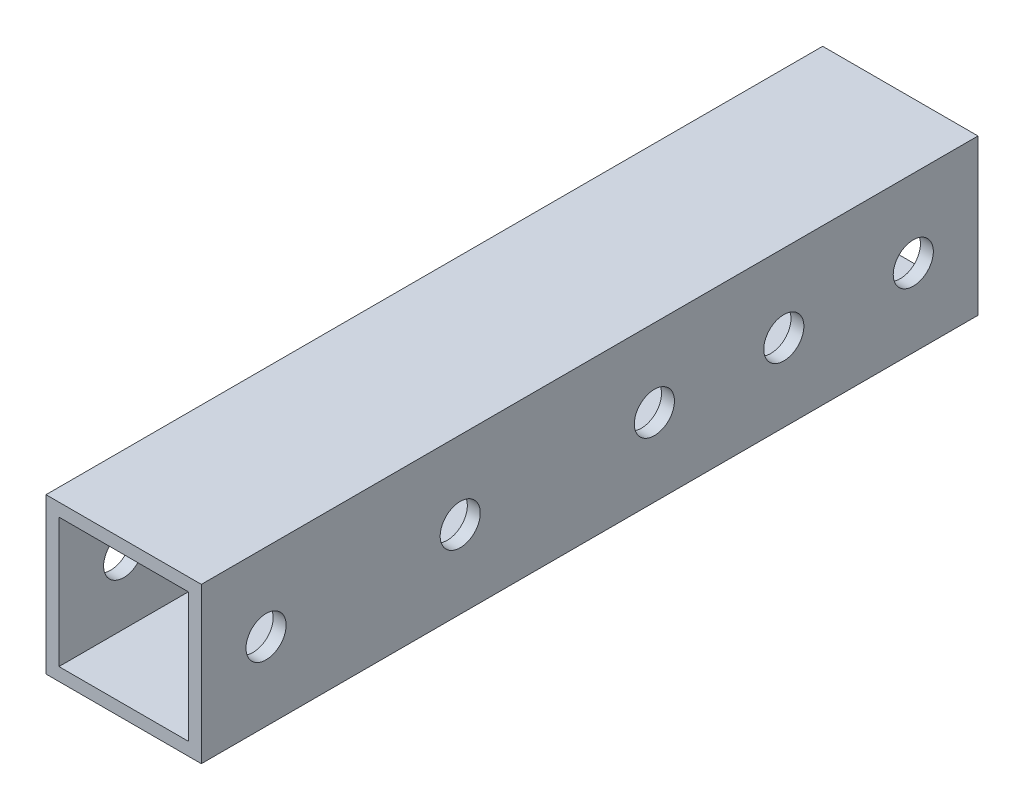
ISO-10303-21;
HEADER;
FILE_DESCRIPTION(('STEP AP214'),'2;1');
FILE_NAME('part.step','',(''),(''),'','','');
FILE_SCHEMA(('AUTOMOTIVE_DESIGN { 1 0 10303 214 1 1 1 1 }'));
ENDSEC;
DATA;
#1=APPLICATION_CONTEXT('core data for automotive mechanical design processes');
#2=APPLICATION_PROTOCOL_DEFINITION('international standard','automotive_design',2000,#1);
#3=PRODUCT_CONTEXT('',#1,'mechanical');
#4=PRODUCT('Part','Part','',(#3));
#5=PRODUCT_RELATED_PRODUCT_CATEGORY('part','',(#4));
#6=PRODUCT_DEFINITION_FORMATION('','',#4);
#7=PRODUCT_DEFINITION_CONTEXT('part definition',#1,'design');
#8=PRODUCT_DEFINITION('design','',#6,#7);
#9=PRODUCT_DEFINITION_SHAPE('','',#8);
#10=(LENGTH_UNIT() NAMED_UNIT(*) SI_UNIT(.MILLI.,.METRE.));
#11=(NAMED_UNIT(*) PLANE_ANGLE_UNIT() SI_UNIT($,.RADIAN.));
#12=(NAMED_UNIT(*) SI_UNIT($,.STERADIAN.) SOLID_ANGLE_UNIT());
#13=UNCERTAINTY_MEASURE_WITH_UNIT(LENGTH_MEASURE(1.E-05),#10,'distance_accuracy_value','');
#14=(GEOMETRIC_REPRESENTATION_CONTEXT(3) GLOBAL_UNCERTAINTY_ASSIGNED_CONTEXT((#13)) GLOBAL_UNIT_ASSIGNED_CONTEXT((#10,
#11,#12)) REPRESENTATION_CONTEXT('',''));
#15=CARTESIAN_POINT('',(0.,0.,0.));
#16=DIRECTION('',(0.,0.,1.));
#17=DIRECTION('',(1.,0.,0.));
#18=AXIS2_PLACEMENT_3D('',#15,#16,#17);
#19=CARTESIAN_POINT('',(0.,0.,-60.));
#20=DIRECTION('',(0.,0.,1.));
#21=DIRECTION('',(-1.,0.,0.));
#22=AXIS2_PLACEMENT_3D('',#19,#20,#21);
#23=PLANE('',#22);
#24=DIRECTION('',(0.,-1.,0.));
#25=VECTOR('',#24,1.);
#26=CARTESIAN_POINT('',(0.,0.,-60.));
#27=LINE('',#26,#25);
#28=CARTESIAN_POINT('',(0.,12.,-60.));
#29=VERTEX_POINT('',#28);
#30=CARTESIAN_POINT('',(0.,0.,-60.));
#31=VERTEX_POINT('',#30);
#32=EDGE_CURVE('E166',#29,#31,#27,.T.);
#33=ORIENTED_EDGE('',*,*,#32,.F.);
#34=DIRECTION('',(-1.,0.,0.));
#35=VECTOR('',#34,1.);
#36=CARTESIAN_POINT('',(0.,12.,-60.));
#37=LINE('',#36,#35);
#38=CARTESIAN_POINT('',(12.,12.,-60.));
#39=VERTEX_POINT('',#38);
#40=EDGE_CURVE('E179',#39,#29,#37,.T.);
#41=ORIENTED_EDGE('',*,*,#40,.F.);
#42=DIRECTION('',(0.,1.,0.));
#43=VECTOR('',#42,1.);
#44=CARTESIAN_POINT('',(12.,0.,-60.));
#45=LINE('',#44,#43);
#46=CARTESIAN_POINT('',(12.,0.,-60.));
#47=VERTEX_POINT('',#46);
#48=EDGE_CURVE('E175',#47,#39,#45,.T.);
#49=ORIENTED_EDGE('',*,*,#48,.F.);
#50=DIRECTION('',(1.,0.,0.));
#51=VECTOR('',#50,1.);
#52=CARTESIAN_POINT('',(0.,0.,-60.));
#53=LINE('',#52,#51);
#54=EDGE_CURVE('E170',#31,#47,#53,.T.);
#55=ORIENTED_EDGE('',*,*,#54,.F.);
#56=EDGE_LOOP('',(#33,#41,#49,#55));
#57=FACE_BOUND('',#56,.T.);
#58=DIRECTION('',(1.,0.,0.));
#59=VECTOR('',#58,1.);
#60=CARTESIAN_POINT('',(1.,1.,-60.));
#61=LINE('',#60,#59);
#62=CARTESIAN_POINT('',(1.,1.,-60.));
#63=VERTEX_POINT('',#62);
#64=CARTESIAN_POINT('',(11.,1.,-60.));
#65=VERTEX_POINT('',#64);
#66=EDGE_CURVE('E117',#63,#65,#61,.T.);
#67=ORIENTED_EDGE('',*,*,#66,.T.);
#68=DIRECTION('',(0.,1.,0.));
#69=VECTOR('',#68,1.);
#70=CARTESIAN_POINT('',(11.,1.,-60.));
#71=LINE('',#70,#69);
#72=CARTESIAN_POINT('',(11.,11.,-60.));
#73=VERTEX_POINT('',#72);
#74=EDGE_CURVE('E127',#65,#73,#71,.T.);
#75=ORIENTED_EDGE('',*,*,#74,.T.);
#76=DIRECTION('',(-1.,0.,0.));
#77=VECTOR('',#76,1.);
#78=CARTESIAN_POINT('',(1.,11.,-60.));
#79=LINE('',#78,#77);
#80=CARTESIAN_POINT('',(1.,11.,-60.));
#81=VERTEX_POINT('',#80);
#82=EDGE_CURVE('E132',#73,#81,#79,.T.);
#83=ORIENTED_EDGE('',*,*,#82,.T.);
#84=DIRECTION('',(0.,-1.,0.));
#85=VECTOR('',#84,1.);
#86=CARTESIAN_POINT('',(1.,1.,-60.));
#87=LINE('',#86,#85);
#88=EDGE_CURVE('E135',#81,#63,#87,.T.);
#89=ORIENTED_EDGE('',*,*,#88,.T.);
#90=EDGE_LOOP('',(#67,#75,#83,#89));
#91=FACE_BOUND('',#90,.T.);
#92=ADVANCED_FACE('F47',(#57,#91),#23,.F.);
#93=CARTESIAN_POINT('',(0.,0.,0.));
#94=DIRECTION('',(0.,0.,1.));
#95=DIRECTION('',(-1.,0.,0.));
#96=AXIS2_PLACEMENT_3D('',#93,#94,#95);
#97=PLANE('',#96);
#98=DIRECTION('',(0.,-1.,0.));
#99=VECTOR('',#98,1.);
#100=CARTESIAN_POINT('',(0.,0.,0.));
#101=LINE('',#100,#99);
#102=CARTESIAN_POINT('',(0.,12.,0.));
#103=VERTEX_POINT('',#102);
#104=CARTESIAN_POINT('',(0.,0.,0.));
#105=VERTEX_POINT('',#104);
#106=EDGE_CURVE('E123',#103,#105,#101,.T.);
#107=ORIENTED_EDGE('',*,*,#106,.T.);
#108=DIRECTION('',(1.,0.,0.));
#109=VECTOR('',#108,1.);
#110=CARTESIAN_POINT('',(0.,0.,0.));
#111=LINE('',#110,#109);
#112=CARTESIAN_POINT('',(12.,0.,0.));
#113=VERTEX_POINT('',#112);
#114=EDGE_CURVE('E187',#105,#113,#111,.T.);
#115=ORIENTED_EDGE('',*,*,#114,.T.);
#116=DIRECTION('',(0.,1.,0.));
#117=VECTOR('',#116,1.);
#118=CARTESIAN_POINT('',(12.,0.,0.));
#119=LINE('',#118,#117);
#120=CARTESIAN_POINT('',(12.,12.,0.));
#121=VERTEX_POINT('',#120);
#122=EDGE_CURVE('E191',#113,#121,#119,.T.);
#123=ORIENTED_EDGE('',*,*,#122,.T.);
#124=DIRECTION('',(-1.,0.,0.));
#125=VECTOR('',#124,1.);
#126=CARTESIAN_POINT('',(0.,12.,0.));
#127=LINE('',#126,#125);
#128=EDGE_CURVE('E171',#121,#103,#127,.T.);
#129=ORIENTED_EDGE('',*,*,#128,.T.);
#130=EDGE_LOOP('',(#107,#115,#123,#129));
#131=FACE_BOUND('',#130,.T.);
#132=DIRECTION('',(0.,-1.,0.));
#133=VECTOR('',#132,1.);
#134=CARTESIAN_POINT('',(1.,1.,0.));
#135=LINE('',#134,#133);
#136=CARTESIAN_POINT('',(1.,11.,0.));
#137=VERTEX_POINT('',#136);
#138=CARTESIAN_POINT('',(1.,1.,0.));
#139=VERTEX_POINT('',#138);
#140=EDGE_CURVE('E137',#137,#139,#135,.T.);
#141=ORIENTED_EDGE('',*,*,#140,.F.);
#142=DIRECTION('',(-1.,0.,0.));
#143=VECTOR('',#142,1.);
#144=CARTESIAN_POINT('',(1.,11.,0.));
#145=LINE('',#144,#143);
#146=CARTESIAN_POINT('',(11.,11.,0.));
#147=VERTEX_POINT('',#146);
#148=EDGE_CURVE('E143',#147,#137,#145,.T.);
#149=ORIENTED_EDGE('',*,*,#148,.F.);
#150=DIRECTION('',(0.,1.,0.));
#151=VECTOR('',#150,1.);
#152=CARTESIAN_POINT('',(11.,1.,0.));
#153=LINE('',#152,#151);
#154=CARTESIAN_POINT('',(11.,1.,0.));
#155=VERTEX_POINT('',#154);
#156=EDGE_CURVE('E155',#155,#147,#153,.T.);
#157=ORIENTED_EDGE('',*,*,#156,.F.);
#158=DIRECTION('',(1.,0.,0.));
#159=VECTOR('',#158,1.);
#160=CARTESIAN_POINT('',(1.,1.,0.));
#161=LINE('',#160,#159);
#162=EDGE_CURVE('E118',#139,#155,#161,.T.);
#163=ORIENTED_EDGE('',*,*,#162,.F.);
#164=EDGE_LOOP('',(#141,#149,#157,#163));
#165=FACE_BOUND('',#164,.T.);
#166=ADVANCED_FACE('F303',(#131,#165),#97,.T.);
#167=CARTESIAN_POINT('',(0.,0.,-60.));
#168=DIRECTION('',(1.,0.,0.));
#169=DIRECTION('',(0.,0.,1.));
#170=AXIS2_PLACEMENT_3D('',#167,#168,#169);
#171=PLANE('',#170);
#172=CARTESIAN_POINT('',(0.,6.,-55.));
#173=DIRECTION('',(-1.,0.,0.));
#174=DIRECTION('',(0.,0.,1.));
#175=AXIS2_PLACEMENT_3D('',#172,#173,#174);
#176=CIRCLE('',#175,1.55);
#177=CARTESIAN_POINT('',(0.,6.,-53.45));
#178=VERTEX_POINT('',#177);
#179=EDGE_CURVE('E255',#178,#178,#176,.T.);
#180=ORIENTED_EDGE('',*,*,#179,.F.);
#181=EDGE_LOOP('',(#180));
#182=FACE_BOUND('',#181,.T.);
#183=CARTESIAN_POINT('',(0.,6.00000000000001,-5.));
#184=DIRECTION('',(-1.,0.,0.));
#185=DIRECTION('',(0.,0.,1.));
#186=AXIS2_PLACEMENT_3D('',#183,#184,#185);
#187=CIRCLE('',#186,1.55);
#188=CARTESIAN_POINT('',(0.,6.00000000000001,-3.45));
#189=VERTEX_POINT('',#188);
#190=EDGE_CURVE('E246',#189,#189,#187,.T.);
#191=ORIENTED_EDGE('',*,*,#190,.F.);
#192=EDGE_LOOP('',(#191));
#193=FACE_BOUND('',#192,.T.);
#194=CARTESIAN_POINT('',(0.,6.00000000000001,-20.));
#195=DIRECTION('',(-1.,0.,0.));
#196=DIRECTION('',(0.,0.,1.));
#197=AXIS2_PLACEMENT_3D('',#194,#195,#196);
#198=CIRCLE('',#197,1.55);
#199=CARTESIAN_POINT('',(0.,6.00000000000001,-18.45));
#200=VERTEX_POINT('',#199);
#201=EDGE_CURVE('E270',#200,#200,#198,.T.);
#202=ORIENTED_EDGE('',*,*,#201,.F.);
#203=EDGE_LOOP('',(#202));
#204=FACE_BOUND('',#203,.T.);
#205=CARTESIAN_POINT('',(0.,6.,-35.));
#206=DIRECTION('',(-1.,0.,0.));
#207=DIRECTION('',(0.,0.,1.));
#208=AXIS2_PLACEMENT_3D('',#205,#206,#207);
#209=CIRCLE('',#208,1.55);
#210=CARTESIAN_POINT('',(0.,6.,-33.45));
#211=VERTEX_POINT('',#210);
#212=EDGE_CURVE('E262',#211,#211,#209,.T.);
#213=ORIENTED_EDGE('',*,*,#212,.F.);
#214=EDGE_LOOP('',(#213));
#215=FACE_BOUND('',#214,.T.);
#216=CARTESIAN_POINT('',(0.,6.,-45.));
#217=DIRECTION('',(-1.,0.,0.));
#218=DIRECTION('',(0.,0.,1.));
#219=AXIS2_PLACEMENT_3D('',#216,#217,#218);
#220=CIRCLE('',#219,1.55);
#221=CARTESIAN_POINT('',(0.,6.,-43.45));
#222=VERTEX_POINT('',#221);
#223=EDGE_CURVE('E208',#222,#222,#220,.T.);
#224=ORIENTED_EDGE('',*,*,#223,.F.);
#225=EDGE_LOOP('',(#224));
#226=FACE_BOUND('',#225,.T.);
#227=ORIENTED_EDGE('',*,*,#106,.F.);
#228=DIRECTION('',(0.,0.,1.));
#229=VECTOR('',#228,1.);
#230=CARTESIAN_POINT('',(0.,12.,-60.));
#231=LINE('',#230,#229);
#232=EDGE_CURVE('E183',#29,#103,#231,.T.);
#233=ORIENTED_EDGE('',*,*,#232,.F.);
#234=ORIENTED_EDGE('',*,*,#32,.T.);
#235=DIRECTION('',(0.,0.,1.));
#236=VECTOR('',#235,1.);
#237=CARTESIAN_POINT('',(0.,0.,-60.));
#238=LINE('',#237,#236);
#239=EDGE_CURVE('E11',#31,#105,#238,.T.);
#240=ORIENTED_EDGE('',*,*,#239,.T.);
#241=EDGE_LOOP('',(#227,#233,#234,#240));
#242=FACE_BOUND('',#241,.T.);
#243=ADVANCED_FACE('F49',(#182,#193,#204,#215,#226,#242),#171,.F.);
#244=CARTESIAN_POINT('',(0.,0.,-60.));
#245=DIRECTION('',(0.,1.,0.));
#246=DIRECTION('',(0.,0.,-1.));
#247=AXIS2_PLACEMENT_3D('',#244,#245,#246);
#248=PLANE('',#247);
#249=ORIENTED_EDGE('',*,*,#114,.F.);
#250=ORIENTED_EDGE('',*,*,#239,.F.);
#251=ORIENTED_EDGE('',*,*,#54,.T.);
#252=DIRECTION('',(0.,0.,1.));
#253=VECTOR('',#252,1.);
#254=CARTESIAN_POINT('',(12.,0.,-60.));
#255=LINE('',#254,#253);
#256=EDGE_CURVE('E57',#47,#113,#255,.T.);
#257=ORIENTED_EDGE('',*,*,#256,.T.);
#258=EDGE_LOOP('',(#249,#250,#251,#257));
#259=FACE_BOUND('',#258,.T.);
#260=ADVANCED_FACE('F320',(#259),#248,.F.);
#261=CARTESIAN_POINT('',(12.,0.,-60.));
#262=DIRECTION('',(-1.,0.,0.));
#263=DIRECTION('',(0.,0.,-1.));
#264=AXIS2_PLACEMENT_3D('',#261,#262,#263);
#265=PLANE('',#264);
#266=CARTESIAN_POINT('',(12.,6.,-55.));
#267=DIRECTION('',(-1.,0.,0.));
#268=DIRECTION('',(0.,0.,1.));
#269=AXIS2_PLACEMENT_3D('',#266,#267,#268);
#270=CIRCLE('',#269,1.55);
#271=CARTESIAN_POINT('',(12.,6.,-53.45));
#272=VERTEX_POINT('',#271);
#273=EDGE_CURVE('E242',#272,#272,#270,.T.);
#274=ORIENTED_EDGE('',*,*,#273,.T.);
#275=EDGE_LOOP('',(#274));
#276=FACE_BOUND('',#275,.T.);
#277=CARTESIAN_POINT('',(12.,6.00000000000001,-5.));
#278=DIRECTION('',(-1.,0.,0.));
#279=DIRECTION('',(0.,0.,1.));
#280=AXIS2_PLACEMENT_3D('',#277,#278,#279);
#281=CIRCLE('',#280,1.55);
#282=CARTESIAN_POINT('',(12.,6.00000000000001,-3.45));
#283=VERTEX_POINT('',#282);
#284=EDGE_CURVE('E250',#283,#283,#281,.T.);
#285=ORIENTED_EDGE('',*,*,#284,.T.);
#286=EDGE_LOOP('',(#285));
#287=FACE_BOUND('',#286,.T.);
#288=CARTESIAN_POINT('',(12.,6.00000000000001,-20.));
#289=DIRECTION('',(-1.,0.,0.));
#290=DIRECTION('',(0.,0.,1.));
#291=AXIS2_PLACEMENT_3D('',#288,#289,#290);
#292=CIRCLE('',#291,1.55);
#293=CARTESIAN_POINT('',(12.,6.00000000000001,-18.45));
#294=VERTEX_POINT('',#293);
#295=EDGE_CURVE('E251',#294,#294,#292,.T.);
#296=ORIENTED_EDGE('',*,*,#295,.T.);
#297=EDGE_LOOP('',(#296));
#298=FACE_BOUND('',#297,.T.);
#299=CARTESIAN_POINT('',(12.,6.,-35.));
#300=DIRECTION('',(-1.,0.,0.));
#301=DIRECTION('',(0.,0.,1.));
#302=AXIS2_PLACEMENT_3D('',#299,#300,#301);
#303=CIRCLE('',#302,1.55);
#304=CARTESIAN_POINT('',(12.,6.,-33.45));
#305=VERTEX_POINT('',#304);
#306=EDGE_CURVE('E266',#305,#305,#303,.T.);
#307=ORIENTED_EDGE('',*,*,#306,.T.);
#308=EDGE_LOOP('',(#307));
#309=FACE_BOUND('',#308,.T.);
#310=CARTESIAN_POINT('',(12.,6.,-45.));
#311=DIRECTION('',(-1.,0.,0.));
#312=DIRECTION('',(0.,0.,1.));
#313=AXIS2_PLACEMENT_3D('',#310,#311,#312);
#314=CIRCLE('',#313,1.55);
#315=CARTESIAN_POINT('',(12.,6.,-43.45));
#316=VERTEX_POINT('',#315);
#317=EDGE_CURVE('E238',#316,#316,#314,.T.);
#318=ORIENTED_EDGE('',*,*,#317,.T.);
#319=EDGE_LOOP('',(#318));
#320=FACE_BOUND('',#319,.T.);
#321=ORIENTED_EDGE('',*,*,#122,.F.);
#322=ORIENTED_EDGE('',*,*,#256,.F.);
#323=ORIENTED_EDGE('',*,*,#48,.T.);
#324=DIRECTION('',(0.,0.,1.));
#325=VECTOR('',#324,1.);
#326=CARTESIAN_POINT('',(12.,12.,-60.));
#327=LINE('',#326,#325);
#328=EDGE_CURVE('E199',#39,#121,#327,.T.);
#329=ORIENTED_EDGE('',*,*,#328,.T.);
#330=EDGE_LOOP('',(#321,#322,#323,#329));
#331=FACE_BOUND('',#330,.T.);
#332=ADVANCED_FACE('F278',(#276,#287,#298,#309,#320,#331),#265,.F.);
#333=CARTESIAN_POINT('',(0.,12.,-60.));
#334=DIRECTION('',(0.,-1.,0.));
#335=DIRECTION('',(0.,0.,1.));
#336=AXIS2_PLACEMENT_3D('',#333,#334,#335);
#337=PLANE('',#336);
#338=ORIENTED_EDGE('',*,*,#128,.F.);
#339=ORIENTED_EDGE('',*,*,#328,.F.);
#340=ORIENTED_EDGE('',*,*,#40,.T.);
#341=ORIENTED_EDGE('',*,*,#232,.T.);
#342=EDGE_LOOP('',(#338,#339,#340,#341));
#343=FACE_BOUND('',#342,.T.);
#344=ADVANCED_FACE('F315',(#343),#337,.F.);
#345=CARTESIAN_POINT('',(1.,1.,-60.));
#346=DIRECTION('',(0.,1.,0.));
#347=DIRECTION('',(0.,0.,-1.));
#348=AXIS2_PLACEMENT_3D('',#345,#346,#347);
#349=PLANE('',#348);
#350=ORIENTED_EDGE('',*,*,#162,.T.);
#351=DIRECTION('',(0.,0.,1.));
#352=VECTOR('',#351,1.);
#353=CARTESIAN_POINT('',(11.,1.,-60.));
#354=LINE('',#353,#352);
#355=EDGE_CURVE('E113',#65,#155,#354,.T.);
#356=ORIENTED_EDGE('',*,*,#355,.F.);
#357=ORIENTED_EDGE('',*,*,#66,.F.);
#358=DIRECTION('',(0.,0.,1.));
#359=VECTOR('',#358,1.);
#360=CARTESIAN_POINT('',(1.,1.,-60.));
#361=LINE('',#360,#359);
#362=EDGE_CURVE('E73',#63,#139,#361,.T.);
#363=ORIENTED_EDGE('',*,*,#362,.T.);
#364=EDGE_LOOP('',(#350,#356,#357,#363));
#365=FACE_BOUND('',#364,.T.);
#366=ADVANCED_FACE('F115',(#365),#349,.T.);
#367=CARTESIAN_POINT('',(11.,1.,-60.));
#368=DIRECTION('',(-1.,0.,0.));
#369=DIRECTION('',(0.,0.,-1.));
#370=AXIS2_PLACEMENT_3D('',#367,#368,#369);
#371=PLANE('',#370);
#372=CARTESIAN_POINT('',(11.,6.,-55.));
#373=DIRECTION('',(1.,0.,0.));
#374=DIRECTION('',(0.,0.,-1.));
#375=AXIS2_PLACEMENT_3D('',#372,#373,#374);
#376=CIRCLE('',#375,1.55);
#377=CARTESIAN_POINT('',(11.,6.,-56.55));
#378=VERTEX_POINT('',#377);
#379=EDGE_CURVE('E146',#378,#378,#376,.T.);
#380=ORIENTED_EDGE('',*,*,#379,.T.);
#381=EDGE_LOOP('',(#380));
#382=FACE_BOUND('',#381,.T.);
#383=CARTESIAN_POINT('',(11.,6.00000000000001,-5.));
#384=DIRECTION('',(1.,0.,0.));
#385=DIRECTION('',(0.,0.,-1.));
#386=AXIS2_PLACEMENT_3D('',#383,#384,#385);
#387=CIRCLE('',#386,1.55);
#388=CARTESIAN_POINT('',(11.,6.00000000000001,-6.55));
#389=VERTEX_POINT('',#388);
#390=EDGE_CURVE('E221',#389,#389,#387,.T.);
#391=ORIENTED_EDGE('',*,*,#390,.T.);
#392=EDGE_LOOP('',(#391));
#393=FACE_BOUND('',#392,.T.);
#394=CARTESIAN_POINT('',(11.,6.00000000000001,-20.));
#395=DIRECTION('',(1.,0.,0.));
#396=DIRECTION('',(0.,0.,-1.));
#397=AXIS2_PLACEMENT_3D('',#394,#395,#396);
#398=CIRCLE('',#397,1.55);
#399=CARTESIAN_POINT('',(11.,6.00000000000001,-21.55));
#400=VERTEX_POINT('',#399);
#401=EDGE_CURVE('E217',#400,#400,#398,.T.);
#402=ORIENTED_EDGE('',*,*,#401,.T.);
#403=EDGE_LOOP('',(#402));
#404=FACE_BOUND('',#403,.T.);
#405=CARTESIAN_POINT('',(11.,6.,-35.));
#406=DIRECTION('',(1.,0.,0.));
#407=DIRECTION('',(0.,0.,-1.));
#408=AXIS2_PLACEMENT_3D('',#405,#406,#407);
#409=CIRCLE('',#408,1.55);
#410=CARTESIAN_POINT('',(11.,6.,-36.55));
#411=VERTEX_POINT('',#410);
#412=EDGE_CURVE('E213',#411,#411,#409,.T.);
#413=ORIENTED_EDGE('',*,*,#412,.T.);
#414=EDGE_LOOP('',(#413));
#415=FACE_BOUND('',#414,.T.);
#416=CARTESIAN_POINT('',(11.,6.,-45.));
#417=DIRECTION('',(1.,0.,0.));
#418=DIRECTION('',(0.,0.,-1.));
#419=AXIS2_PLACEMENT_3D('',#416,#417,#418);
#420=CIRCLE('',#419,1.55);
#421=CARTESIAN_POINT('',(11.,6.,-46.55));
#422=VERTEX_POINT('',#421);
#423=EDGE_CURVE('E207',#422,#422,#420,.T.);
#424=ORIENTED_EDGE('',*,*,#423,.T.);
#425=EDGE_LOOP('',(#424));
#426=FACE_BOUND('',#425,.T.);
#427=ORIENTED_EDGE('',*,*,#156,.T.);
#428=DIRECTION('',(0.,0.,1.));
#429=VECTOR('',#428,1.);
#430=CARTESIAN_POINT('',(11.,11.,-60.));
#431=LINE('',#430,#429);
#432=EDGE_CURVE('E124',#73,#147,#431,.T.);
#433=ORIENTED_EDGE('',*,*,#432,.F.);
#434=ORIENTED_EDGE('',*,*,#74,.F.);
#435=ORIENTED_EDGE('',*,*,#355,.T.);
#436=EDGE_LOOP('',(#427,#433,#434,#435));
#437=FACE_BOUND('',#436,.T.);
#438=ADVANCED_FACE('F128',(#382,#393,#404,#415,#426,#437),#371,.T.);
#439=CARTESIAN_POINT('',(1.,11.,-60.));
#440=DIRECTION('',(0.,-1.,0.));
#441=DIRECTION('',(0.,0.,1.));
#442=AXIS2_PLACEMENT_3D('',#439,#440,#441);
#443=PLANE('',#442);
#444=ORIENTED_EDGE('',*,*,#148,.T.);
#445=DIRECTION('',(0.,0.,1.));
#446=VECTOR('',#445,1.);
#447=CARTESIAN_POINT('',(1.,11.,-60.));
#448=LINE('',#447,#446);
#449=EDGE_CURVE('E65',#81,#137,#448,.T.);
#450=ORIENTED_EDGE('',*,*,#449,.F.);
#451=ORIENTED_EDGE('',*,*,#82,.F.);
#452=ORIENTED_EDGE('',*,*,#432,.T.);
#453=EDGE_LOOP('',(#444,#450,#451,#452));
#454=FACE_BOUND('',#453,.T.);
#455=ADVANCED_FACE('F342',(#454),#443,.T.);
#456=CARTESIAN_POINT('',(1.,1.,-60.));
#457=DIRECTION('',(1.,0.,0.));
#458=DIRECTION('',(0.,0.,1.));
#459=AXIS2_PLACEMENT_3D('',#456,#457,#458);
#460=PLANE('',#459);
#461=CARTESIAN_POINT('',(1.,6.,-55.));
#462=DIRECTION('',(-1.,0.,0.));
#463=DIRECTION('',(0.,0.,1.));
#464=AXIS2_PLACEMENT_3D('',#461,#462,#463);
#465=CIRCLE('',#464,1.55);
#466=CARTESIAN_POINT('',(1.,6.,-53.45));
#467=VERTEX_POINT('',#466);
#468=EDGE_CURVE('E51',#467,#467,#465,.T.);
#469=ORIENTED_EDGE('',*,*,#468,.T.);
#470=EDGE_LOOP('',(#469));
#471=FACE_BOUND('',#470,.T.);
#472=CARTESIAN_POINT('',(1.,6.00000000000001,-5.));
#473=DIRECTION('',(-1.,0.,0.));
#474=DIRECTION('',(0.,0.,1.));
#475=AXIS2_PLACEMENT_3D('',#472,#473,#474);
#476=CIRCLE('',#475,1.55);
#477=CARTESIAN_POINT('',(1.,6.00000000000001,-3.45));
#478=VERTEX_POINT('',#477);
#479=EDGE_CURVE('E218',#478,#478,#476,.T.);
#480=ORIENTED_EDGE('',*,*,#479,.T.);
#481=EDGE_LOOP('',(#480));
#482=FACE_BOUND('',#481,.T.);
#483=CARTESIAN_POINT('',(1.,6.00000000000001,-20.));
#484=DIRECTION('',(-1.,0.,0.));
#485=DIRECTION('',(0.,0.,1.));
#486=AXIS2_PLACEMENT_3D('',#483,#484,#485);
#487=CIRCLE('',#486,1.55);
#488=CARTESIAN_POINT('',(1.,6.00000000000001,-18.45));
#489=VERTEX_POINT('',#488);
#490=EDGE_CURVE('E214',#489,#489,#487,.T.);
#491=ORIENTED_EDGE('',*,*,#490,.T.);
#492=EDGE_LOOP('',(#491));
#493=FACE_BOUND('',#492,.T.);
#494=CARTESIAN_POINT('',(1.,6.,-35.));
#495=DIRECTION('',(-1.,0.,0.));
#496=DIRECTION('',(0.,0.,1.));
#497=AXIS2_PLACEMENT_3D('',#494,#495,#496);
#498=CIRCLE('',#497,1.55);
#499=CARTESIAN_POINT('',(1.,6.,-33.45));
#500=VERTEX_POINT('',#499);
#501=EDGE_CURVE('E209',#500,#500,#498,.T.);
#502=ORIENTED_EDGE('',*,*,#501,.T.);
#503=EDGE_LOOP('',(#502));
#504=FACE_BOUND('',#503,.T.);
#505=CARTESIAN_POINT('',(1.,6.,-45.));
#506=DIRECTION('',(-1.,0.,0.));
#507=DIRECTION('',(0.,0.,1.));
#508=AXIS2_PLACEMENT_3D('',#505,#506,#507);
#509=CIRCLE('',#508,1.55);
#510=CARTESIAN_POINT('',(1.,6.,-43.45));
#511=VERTEX_POINT('',#510);
#512=EDGE_CURVE('E203',#511,#511,#509,.T.);
#513=ORIENTED_EDGE('',*,*,#512,.T.);
#514=EDGE_LOOP('',(#513));
#515=FACE_BOUND('',#514,.T.);
#516=ORIENTED_EDGE('',*,*,#140,.T.);
#517=ORIENTED_EDGE('',*,*,#362,.F.);
#518=ORIENTED_EDGE('',*,*,#88,.F.);
#519=ORIENTED_EDGE('',*,*,#449,.T.);
#520=EDGE_LOOP('',(#516,#517,#518,#519));
#521=FACE_BOUND('',#520,.T.);
#522=ADVANCED_FACE('F341',(#471,#482,#493,#504,#515,#521),#460,.T.);
#523=CARTESIAN_POINT('',(0.,6.,-45.));
#524=DIRECTION('',(1.,0.,0.));
#525=DIRECTION('',(0.,0.,1.));
#526=AXIS2_PLACEMENT_3D('',#523,#524,#525);
#527=CYLINDRICAL_SURFACE('',#526,1.55);
#528=ORIENTED_EDGE('',*,*,#512,.F.);
#529=EDGE_LOOP('',(#528));
#530=FACE_BOUND('',#529,.T.);
#531=ORIENTED_EDGE('',*,*,#223,.T.);
#532=EDGE_LOOP('',(#531));
#533=FACE_BOUND('',#532,.T.);
#534=ADVANCED_FACE('F349',(#530,#533),#527,.F.);
#535=CARTESIAN_POINT('',(0.,6.,-35.));
#536=DIRECTION('',(1.,0.,0.));
#537=DIRECTION('',(0.,0.,1.));
#538=AXIS2_PLACEMENT_3D('',#535,#536,#537);
#539=CYLINDRICAL_SURFACE('',#538,1.55);
#540=ORIENTED_EDGE('',*,*,#501,.F.);
#541=EDGE_LOOP('',(#540));
#542=FACE_BOUND('',#541,.T.);
#543=ORIENTED_EDGE('',*,*,#212,.T.);
#544=EDGE_LOOP('',(#543));
#545=FACE_BOUND('',#544,.T.);
#546=ADVANCED_FACE('F299',(#542,#545),#539,.F.);
#547=CARTESIAN_POINT('',(0.,6.00000000000001,-20.));
#548=DIRECTION('',(1.,0.,0.));
#549=DIRECTION('',(0.,0.,1.));
#550=AXIS2_PLACEMENT_3D('',#547,#548,#549);
#551=CYLINDRICAL_SURFACE('',#550,1.55);
#552=ORIENTED_EDGE('',*,*,#490,.F.);
#553=EDGE_LOOP('',(#552));
#554=FACE_BOUND('',#553,.T.);
#555=ORIENTED_EDGE('',*,*,#201,.T.);
#556=EDGE_LOOP('',(#555));
#557=FACE_BOUND('',#556,.T.);
#558=ADVANCED_FACE('F287',(#554,#557),#551,.F.);
#559=CARTESIAN_POINT('',(0.,6.00000000000001,-5.));
#560=DIRECTION('',(1.,0.,0.));
#561=DIRECTION('',(0.,0.,1.));
#562=AXIS2_PLACEMENT_3D('',#559,#560,#561);
#563=CYLINDRICAL_SURFACE('',#562,1.55);
#564=ORIENTED_EDGE('',*,*,#479,.F.);
#565=EDGE_LOOP('',(#564));
#566=FACE_BOUND('',#565,.T.);
#567=ORIENTED_EDGE('',*,*,#190,.T.);
#568=EDGE_LOOP('',(#567));
#569=FACE_BOUND('',#568,.T.);
#570=ADVANCED_FACE('F295',(#566,#569),#563,.F.);
#571=CARTESIAN_POINT('',(0.,6.,-55.));
#572=DIRECTION('',(1.,0.,0.));
#573=DIRECTION('',(0.,0.,1.));
#574=AXIS2_PLACEMENT_3D('',#571,#572,#573);
#575=CYLINDRICAL_SURFACE('',#574,1.55);
#576=ORIENTED_EDGE('',*,*,#468,.F.);
#577=EDGE_LOOP('',(#576));
#578=FACE_BOUND('',#577,.T.);
#579=ORIENTED_EDGE('',*,*,#179,.T.);
#580=EDGE_LOOP('',(#579));
#581=FACE_BOUND('',#580,.T.);
#582=ADVANCED_FACE('F358',(#578,#581),#575,.F.);
#583=ORIENTED_EDGE('',*,*,#423,.F.);
#584=EDGE_LOOP('',(#583));
#585=FACE_BOUND('',#584,.T.);
#586=ORIENTED_EDGE('',*,*,#317,.F.);
#587=EDGE_LOOP('',(#586));
#588=FACE_BOUND('',#587,.T.);
#589=ADVANCED_FACE('F296',(#585,#588),#527,.F.);
#590=ORIENTED_EDGE('',*,*,#412,.F.);
#591=EDGE_LOOP('',(#590));
#592=FACE_BOUND('',#591,.T.);
#593=ORIENTED_EDGE('',*,*,#306,.F.);
#594=EDGE_LOOP('',(#593));
#595=FACE_BOUND('',#594,.T.);
#596=ADVANCED_FACE('F284',(#592,#595),#539,.F.);
#597=ORIENTED_EDGE('',*,*,#401,.F.);
#598=EDGE_LOOP('',(#597));
#599=FACE_BOUND('',#598,.T.);
#600=ORIENTED_EDGE('',*,*,#295,.F.);
#601=EDGE_LOOP('',(#600));
#602=FACE_BOUND('',#601,.T.);
#603=ADVANCED_FACE('F281',(#599,#602),#551,.F.);
#604=ORIENTED_EDGE('',*,*,#390,.F.);
#605=EDGE_LOOP('',(#604));
#606=FACE_BOUND('',#605,.T.);
#607=ORIENTED_EDGE('',*,*,#284,.F.);
#608=EDGE_LOOP('',(#607));
#609=FACE_BOUND('',#608,.T.);
#610=ADVANCED_FACE('F283',(#606,#609),#563,.F.);
#611=ORIENTED_EDGE('',*,*,#379,.F.);
#612=EDGE_LOOP('',(#611));
#613=FACE_BOUND('',#612,.T.);
#614=ORIENTED_EDGE('',*,*,#273,.F.);
#615=EDGE_LOOP('',(#614));
#616=FACE_BOUND('',#615,.T.);
#617=ADVANCED_FACE('F292',(#613,#616),#575,.F.);
#618=CLOSED_SHELL('',(#92,#166,#243,#260,#332,#344,#366,#438,#455,#522,#534,#546,#558,#570,#582,
#589,#596,#603,#610,#617));
#619=MANIFOLD_SOLID_BREP('B2',#618);
#620=ADVANCED_BREP_SHAPE_REPRESENTATION('',(#18,#619),#14);
#621=SHAPE_DEFINITION_REPRESENTATION(#9,#620);
ENDSEC;
END-ISO-10303-21;
